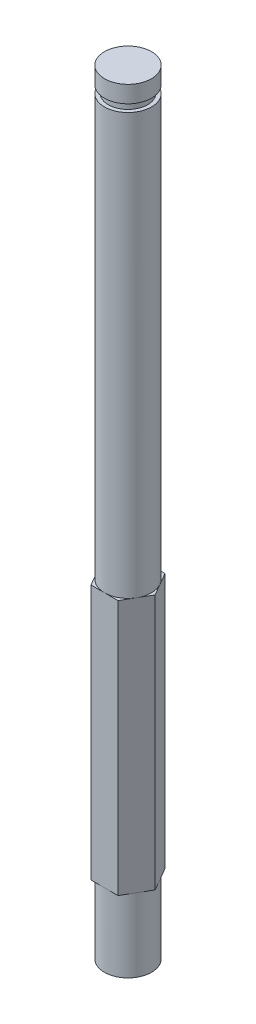
ISO-10303-21;
HEADER;
FILE_DESCRIPTION(('STEP AP214'),'2;1');
FILE_NAME('part.step','',(''),(''),'','','');
FILE_SCHEMA(('AUTOMOTIVE_DESIGN { 1 0 10303 214 1 1 1 1 }'));
ENDSEC;
DATA;
#1=APPLICATION_CONTEXT('core data for automotive mechanical design processes');
#2=APPLICATION_PROTOCOL_DEFINITION('international standard','automotive_design',2000,#1);
#3=PRODUCT_CONTEXT('',#1,'mechanical');
#4=PRODUCT('Part','Part','',(#3));
#5=PRODUCT_RELATED_PRODUCT_CATEGORY('part','',(#4));
#6=PRODUCT_DEFINITION_FORMATION('','',#4);
#7=PRODUCT_DEFINITION_CONTEXT('part definition',#1,'design');
#8=PRODUCT_DEFINITION('design','',#6,#7);
#9=PRODUCT_DEFINITION_SHAPE('','',#8);
#10=(LENGTH_UNIT() NAMED_UNIT(*) SI_UNIT(.MILLI.,.METRE.));
#11=(NAMED_UNIT(*) PLANE_ANGLE_UNIT() SI_UNIT($,.RADIAN.));
#12=(NAMED_UNIT(*) SI_UNIT($,.STERADIAN.) SOLID_ANGLE_UNIT());
#13=UNCERTAINTY_MEASURE_WITH_UNIT(LENGTH_MEASURE(1.E-05),#10,'distance_accuracy_value','');
#14=(GEOMETRIC_REPRESENTATION_CONTEXT(3) GLOBAL_UNCERTAINTY_ASSIGNED_CONTEXT((#13)) GLOBAL_UNIT_ASSIGNED_CONTEXT((#10,
#11,#12)) REPRESENTATION_CONTEXT('',''));
#15=CARTESIAN_POINT('',(0.,0.,0.));
#16=DIRECTION('',(0.,0.,1.));
#17=DIRECTION('',(1.,0.,0.));
#18=AXIS2_PLACEMENT_3D('',#15,#16,#17);
#19=CARTESIAN_POINT('',(0.,0.,0.));
#20=DIRECTION('',(0.,1.,0.));
#21=DIRECTION('',(0.,0.,1.));
#22=AXIS2_PLACEMENT_3D('',#19,#20,#21);
#23=PLANE('',#22);
#24=CARTESIAN_POINT('',(0.,0.,0.));
#25=DIRECTION('',(0.,-1.,0.));
#26=DIRECTION('',(0.,0.,-1.));
#27=AXIS2_PLACEMENT_3D('',#24,#25,#26);
#28=CIRCLE('',#27,3.175);
#29=CARTESIAN_POINT('',(0.,0.,-3.175));
#30=VERTEX_POINT('',#29);
#31=CARTESIAN_POINT('',(2.74963065701559,0.,-1.5875));
#32=VERTEX_POINT('',#31);
#33=EDGE_CURVE('E54',#30,#32,#28,.T.);
#34=ORIENTED_EDGE('',*,*,#33,.F.);
#35=DIRECTION('',(-1.,0.,0.));
#36=VECTOR('',#35,1.);
#37=CARTESIAN_POINT('',(1.83308710467706,0.,-3.175));
#38=LINE('',#37,#36);
#39=CARTESIAN_POINT('',(1.83308710467706,0.,-3.175));
#40=VERTEX_POINT('',#39);
#41=EDGE_CURVE('E138',#40,#30,#38,.T.);
#42=ORIENTED_EDGE('',*,*,#41,.F.);
#43=DIRECTION('',(-0.5,0.,-0.866025403784438));
#44=VECTOR('',#43,1.);
#45=CARTESIAN_POINT('',(3.66617420935412,0.,0.));
#46=LINE('',#45,#44);
#47=EDGE_CURVE('E155',#32,#40,#46,.T.);
#48=ORIENTED_EDGE('',*,*,#47,.F.);
#49=EDGE_LOOP('',(#34,#42,#48));
#50=FACE_BOUND('',#49,.T.);
#51=ADVANCED_FACE('F43',(#50),#23,.F.);
#52=CARTESIAN_POINT('',(2.74963065701559,0.,1.5875));
#53=VERTEX_POINT('',#52);
#54=EDGE_CURVE('E11',#32,#53,#28,.T.);
#55=ORIENTED_EDGE('',*,*,#54,.F.);
#56=CARTESIAN_POINT('',(3.66617420935412,0.,0.));
#57=VERTEX_POINT('',#56);
#58=EDGE_CURVE('E153',#57,#32,#46,.T.);
#59=ORIENTED_EDGE('',*,*,#58,.F.);
#60=DIRECTION('',(0.5,0.,-0.866025403784438));
#61=VECTOR('',#60,1.);
#62=CARTESIAN_POINT('',(1.83308710467706,0.,3.175));
#63=LINE('',#62,#61);
#64=EDGE_CURVE('E218',#53,#57,#63,.T.);
#65=ORIENTED_EDGE('',*,*,#64,.F.);
#66=EDGE_LOOP('',(#55,#59,#65));
#67=FACE_BOUND('',#66,.T.);
#68=ADVANCED_FACE('F269',(#67),#23,.F.);
#69=CARTESIAN_POINT('',(0.,0.,3.175));
#70=VERTEX_POINT('',#69);
#71=EDGE_CURVE('E52',#53,#70,#28,.T.);
#72=ORIENTED_EDGE('',*,*,#71,.F.);
#73=CARTESIAN_POINT('',(1.83308710467706,0.,3.175));
#74=VERTEX_POINT('',#73);
#75=EDGE_CURVE('E219',#74,#53,#63,.T.);
#76=ORIENTED_EDGE('',*,*,#75,.F.);
#77=DIRECTION('',(1.,0.,0.));
#78=VECTOR('',#77,1.);
#79=CARTESIAN_POINT('',(-1.83308710467706,0.,3.175));
#80=LINE('',#79,#78);
#81=EDGE_CURVE('E214',#70,#74,#80,.T.);
#82=ORIENTED_EDGE('',*,*,#81,.F.);
#83=EDGE_LOOP('',(#72,#76,#82));
#84=FACE_BOUND('',#83,.T.);
#85=ADVANCED_FACE('F264',(#84),#23,.F.);
#86=CARTESIAN_POINT('',(-2.74963065701559,0.,1.5875));
#87=VERTEX_POINT('',#86);
#88=EDGE_CURVE('E162',#70,#87,#28,.T.);
#89=ORIENTED_EDGE('',*,*,#88,.F.);
#90=CARTESIAN_POINT('',(-1.83308710467706,0.,3.175));
#91=VERTEX_POINT('',#90);
#92=EDGE_CURVE('E215',#91,#70,#80,.T.);
#93=ORIENTED_EDGE('',*,*,#92,.F.);
#94=DIRECTION('',(0.5,0.,0.866025403784438));
#95=VECTOR('',#94,1.);
#96=CARTESIAN_POINT('',(-3.66617420935413,0.,0.));
#97=LINE('',#96,#95);
#98=EDGE_CURVE('E210',#87,#91,#97,.T.);
#99=ORIENTED_EDGE('',*,*,#98,.F.);
#100=EDGE_LOOP('',(#89,#93,#99));
#101=FACE_BOUND('',#100,.T.);
#102=ADVANCED_FACE('F291',(#101),#23,.F.);
#103=CARTESIAN_POINT('',(-2.74963065701559,0.,-1.5875));
#104=VERTEX_POINT('',#103);
#105=EDGE_CURVE('E68',#87,#104,#28,.T.);
#106=ORIENTED_EDGE('',*,*,#105,.F.);
#107=CARTESIAN_POINT('',(-3.66617420935413,0.,0.));
#108=VERTEX_POINT('',#107);
#109=EDGE_CURVE('E211',#108,#87,#97,.T.);
#110=ORIENTED_EDGE('',*,*,#109,.F.);
#111=DIRECTION('',(-0.5,0.,0.866025403784438));
#112=VECTOR('',#111,1.);
#113=CARTESIAN_POINT('',(-1.83308710467706,0.,-3.175));
#114=LINE('',#113,#112);
#115=EDGE_CURVE('E148',#104,#108,#114,.T.);
#116=ORIENTED_EDGE('',*,*,#115,.F.);
#117=EDGE_LOOP('',(#106,#110,#116));
#118=FACE_BOUND('',#117,.T.);
#119=ADVANCED_FACE('F292',(#118),#23,.F.);
#120=CARTESIAN_POINT('',(0.,34.544,0.));
#121=DIRECTION('',(0.,1.,0.));
#122=DIRECTION('',(0.,0.,1.));
#123=AXIS2_PLACEMENT_3D('',#120,#121,#122);
#124=PLANE('',#123);
#125=CARTESIAN_POINT('',(0.,34.544,0.));
#126=DIRECTION('',(0.,1.,0.));
#127=DIRECTION('',(0.,0.,1.));
#128=AXIS2_PLACEMENT_3D('',#125,#126,#127);
#129=CIRCLE('',#128,3.175);
#130=CARTESIAN_POINT('',(0.,34.544,3.175));
#131=VERTEX_POINT('',#130);
#132=CARTESIAN_POINT('',(2.74963065701559,34.544,1.5875));
#133=VERTEX_POINT('',#132);
#134=EDGE_CURVE('E176',#131,#133,#129,.T.);
#135=ORIENTED_EDGE('',*,*,#134,.F.);
#136=DIRECTION('',(1.,0.,0.));
#137=VECTOR('',#136,1.);
#138=CARTESIAN_POINT('',(-1.83308710467706,34.544,3.175));
#139=LINE('',#138,#137);
#140=CARTESIAN_POINT('',(1.83308710467706,34.544,3.175));
#141=VERTEX_POINT('',#140);
#142=EDGE_CURVE('E200',#131,#141,#139,.T.);
#143=ORIENTED_EDGE('',*,*,#142,.T.);
#144=DIRECTION('',(0.5,0.,-0.866025403784438));
#145=VECTOR('',#144,1.);
#146=CARTESIAN_POINT('',(1.83308710467706,34.544,3.175));
#147=LINE('',#146,#145);
#148=EDGE_CURVE('E204',#141,#133,#147,.T.);
#149=ORIENTED_EDGE('',*,*,#148,.T.);
#150=EDGE_LOOP('',(#135,#143,#149));
#151=FACE_BOUND('',#150,.T.);
#152=ADVANCED_FACE('F255',(#151),#124,.T.);
#153=CARTESIAN_POINT('',(2.74963065701559,34.544,-1.5875));
#154=VERTEX_POINT('',#153);
#155=EDGE_CURVE('E164',#133,#154,#129,.T.);
#156=ORIENTED_EDGE('',*,*,#155,.F.);
#157=CARTESIAN_POINT('',(3.66617420935412,34.544,0.));
#158=VERTEX_POINT('',#157);
#159=EDGE_CURVE('E203',#133,#158,#147,.T.);
#160=ORIENTED_EDGE('',*,*,#159,.T.);
#161=DIRECTION('',(-0.5,0.,-0.866025403784438));
#162=VECTOR('',#161,1.);
#163=CARTESIAN_POINT('',(3.66617420935412,34.544,0.));
#164=LINE('',#163,#162);
#165=EDGE_CURVE('E184',#158,#154,#164,.T.);
#166=ORIENTED_EDGE('',*,*,#165,.T.);
#167=EDGE_LOOP('',(#156,#160,#166));
#168=FACE_BOUND('',#167,.T.);
#169=ADVANCED_FACE('F248',(#168),#124,.T.);
#170=CARTESIAN_POINT('',(0.,34.544,-3.175));
#171=VERTEX_POINT('',#170);
#172=EDGE_CURVE('E241',#154,#171,#129,.T.);
#173=ORIENTED_EDGE('',*,*,#172,.F.);
#174=CARTESIAN_POINT('',(1.83308710467706,34.544,-3.175));
#175=VERTEX_POINT('',#174);
#176=EDGE_CURVE('E188',#154,#175,#164,.T.);
#177=ORIENTED_EDGE('',*,*,#176,.T.);
#178=DIRECTION('',(-1.,0.,0.));
#179=VECTOR('',#178,1.);
#180=CARTESIAN_POINT('',(1.83308710467706,34.544,-3.175));
#181=LINE('',#180,#179);
#182=EDGE_CURVE('E189',#175,#171,#181,.T.);
#183=ORIENTED_EDGE('',*,*,#182,.T.);
#184=EDGE_LOOP('',(#173,#177,#183));
#185=FACE_BOUND('',#184,.T.);
#186=ADVANCED_FACE('F273',(#185),#124,.T.);
#187=CARTESIAN_POINT('',(-2.74963065701559,34.544,-1.5875));
#188=VERTEX_POINT('',#187);
#189=EDGE_CURVE('E239',#171,#188,#129,.T.);
#190=ORIENTED_EDGE('',*,*,#189,.F.);
#191=CARTESIAN_POINT('',(-1.83308710467706,34.544,-3.175));
#192=VERTEX_POINT('',#191);
#193=EDGE_CURVE('E187',#171,#192,#181,.T.);
#194=ORIENTED_EDGE('',*,*,#193,.T.);
#195=DIRECTION('',(-0.5,0.,0.866025403784438));
#196=VECTOR('',#195,1.);
#197=CARTESIAN_POINT('',(-1.83308710467706,34.544,-3.175));
#198=LINE('',#197,#196);
#199=EDGE_CURVE('E193',#192,#188,#198,.T.);
#200=ORIENTED_EDGE('',*,*,#199,.T.);
#201=EDGE_LOOP('',(#190,#194,#200));
#202=FACE_BOUND('',#201,.T.);
#203=ADVANCED_FACE('F276',(#202),#124,.T.);
#204=CARTESIAN_POINT('',(-2.74963065701559,34.544,1.5875));
#205=VERTEX_POINT('',#204);
#206=EDGE_CURVE('E236',#188,#205,#129,.T.);
#207=ORIENTED_EDGE('',*,*,#206,.F.);
#208=CARTESIAN_POINT('',(-3.66617420935413,34.544,0.));
#209=VERTEX_POINT('',#208);
#210=EDGE_CURVE('E192',#188,#209,#198,.T.);
#211=ORIENTED_EDGE('',*,*,#210,.T.);
#212=DIRECTION('',(0.5,0.,0.866025403784438));
#213=VECTOR('',#212,1.);
#214=CARTESIAN_POINT('',(-3.66617420935413,34.544,0.));
#215=LINE('',#214,#213);
#216=EDGE_CURVE('E197',#209,#205,#215,.T.);
#217=ORIENTED_EDGE('',*,*,#216,.T.);
#218=EDGE_LOOP('',(#207,#211,#217));
#219=FACE_BOUND('',#218,.T.);
#220=ADVANCED_FACE('F282',(#219),#124,.T.);
#221=CARTESIAN_POINT('',(3.66617420935412,34.544,0.));
#222=DIRECTION('',(-0.866025403784438,0.,0.5));
#223=DIRECTION('',(0.5,0.,0.866025403784439));
#224=AXIS2_PLACEMENT_3D('',#221,#222,#223);
#225=PLANE('',#224);
#226=ORIENTED_EDGE('',*,*,#58,.T.);
#227=ORIENTED_EDGE('',*,*,#47,.T.);
#228=DIRECTION('',(0.,-1.,0.));
#229=VECTOR('',#228,1.);
#230=CARTESIAN_POINT('',(1.83308710467706,34.544,-3.175));
#231=LINE('',#230,#229);
#232=EDGE_CURVE('E47',#175,#40,#231,.T.);
#233=ORIENTED_EDGE('',*,*,#232,.F.);
#234=ORIENTED_EDGE('',*,*,#176,.F.);
#235=ORIENTED_EDGE('',*,*,#165,.F.);
#236=DIRECTION('',(0.,-1.,0.));
#237=VECTOR('',#236,1.);
#238=CARTESIAN_POINT('',(3.66617420935412,34.544,0.));
#239=LINE('',#238,#237);
#240=EDGE_CURVE('E207',#158,#57,#239,.T.);
#241=ORIENTED_EDGE('',*,*,#240,.T.);
#242=EDGE_LOOP('',(#226,#227,#233,#234,#235,#241));
#243=FACE_BOUND('',#242,.T.);
#244=ADVANCED_FACE('F45',(#243),#225,.F.);
#245=CARTESIAN_POINT('',(1.83308710467706,34.544,-3.175));
#246=DIRECTION('',(0.,0.,1.));
#247=DIRECTION('',(1.,0.,0.));
#248=AXIS2_PLACEMENT_3D('',#245,#246,#247);
#249=PLANE('',#248);
#250=ORIENTED_EDGE('',*,*,#41,.T.);
#251=CARTESIAN_POINT('',(-1.83308710467706,0.,-3.175));
#252=VERTEX_POINT('',#251);
#253=EDGE_CURVE('E141',#30,#252,#38,.T.);
#254=ORIENTED_EDGE('',*,*,#253,.T.);
#255=DIRECTION('',(0.,-1.,0.));
#256=VECTOR('',#255,1.);
#257=CARTESIAN_POINT('',(-1.83308710467706,34.544,-3.175));
#258=LINE('',#257,#256);
#259=EDGE_CURVE('E232',#192,#252,#258,.T.);
#260=ORIENTED_EDGE('',*,*,#259,.F.);
#261=ORIENTED_EDGE('',*,*,#193,.F.);
#262=ORIENTED_EDGE('',*,*,#182,.F.);
#263=ORIENTED_EDGE('',*,*,#232,.T.);
#264=EDGE_LOOP('',(#250,#254,#260,#261,#262,#263));
#265=FACE_BOUND('',#264,.T.);
#266=ADVANCED_FACE('F139',(#265),#249,.F.);
#267=CARTESIAN_POINT('',(-1.83308710467706,34.544,-3.175));
#268=DIRECTION('',(0.866025403784438,0.,0.5));
#269=DIRECTION('',(0.5,0.,-0.866025403784439));
#270=AXIS2_PLACEMENT_3D('',#267,#268,#269);
#271=PLANE('',#270);
#272=EDGE_CURVE('E152',#252,#104,#114,.T.);
#273=ORIENTED_EDGE('',*,*,#272,.T.);
#274=ORIENTED_EDGE('',*,*,#115,.T.);
#275=DIRECTION('',(0.,-1.,0.));
#276=VECTOR('',#275,1.);
#277=CARTESIAN_POINT('',(-3.66617420935413,34.544,0.));
#278=LINE('',#277,#276);
#279=EDGE_CURVE('E230',#209,#108,#278,.T.);
#280=ORIENTED_EDGE('',*,*,#279,.F.);
#281=ORIENTED_EDGE('',*,*,#210,.F.);
#282=ORIENTED_EDGE('',*,*,#199,.F.);
#283=ORIENTED_EDGE('',*,*,#259,.T.);
#284=EDGE_LOOP('',(#273,#274,#280,#281,#282,#283));
#285=FACE_BOUND('',#284,.T.);
#286=ADVANCED_FACE('F278',(#285),#271,.F.);
#287=CARTESIAN_POINT('',(-3.66617420935413,34.544,0.));
#288=DIRECTION('',(0.866025403784438,0.,-0.5));
#289=DIRECTION('',(-0.5,0.,-0.866025403784439));
#290=AXIS2_PLACEMENT_3D('',#287,#288,#289);
#291=PLANE('',#290);
#292=ORIENTED_EDGE('',*,*,#109,.T.);
#293=ORIENTED_EDGE('',*,*,#98,.T.);
#294=DIRECTION('',(0.,-1.,0.));
#295=VECTOR('',#294,1.);
#296=CARTESIAN_POINT('',(-1.83308710467706,34.544,3.175));
#297=LINE('',#296,#295);
#298=CARTESIAN_POINT('',(-1.83308710467706,34.544,3.175));
#299=VERTEX_POINT('',#298);
#300=EDGE_CURVE('E227',#299,#91,#297,.T.);
#301=ORIENTED_EDGE('',*,*,#300,.F.);
#302=EDGE_CURVE('E196',#205,#299,#215,.T.);
#303=ORIENTED_EDGE('',*,*,#302,.F.);
#304=ORIENTED_EDGE('',*,*,#216,.F.);
#305=ORIENTED_EDGE('',*,*,#279,.T.);
#306=EDGE_LOOP('',(#292,#293,#301,#303,#304,#305));
#307=FACE_BOUND('',#306,.T.);
#308=ADVANCED_FACE('F285',(#307),#291,.F.);
#309=CARTESIAN_POINT('',(-1.83308710467706,34.544,3.175));
#310=DIRECTION('',(0.,0.,-1.));
#311=DIRECTION('',(-1.,0.,0.));
#312=AXIS2_PLACEMENT_3D('',#309,#310,#311);
#313=PLANE('',#312);
#314=ORIENTED_EDGE('',*,*,#92,.T.);
#315=ORIENTED_EDGE('',*,*,#81,.T.);
#316=DIRECTION('',(0.,-1.,0.));
#317=VECTOR('',#316,1.);
#318=CARTESIAN_POINT('',(1.83308710467706,34.544,3.175));
#319=LINE('',#318,#317);
#320=EDGE_CURVE('E224',#141,#74,#319,.T.);
#321=ORIENTED_EDGE('',*,*,#320,.F.);
#322=ORIENTED_EDGE('',*,*,#142,.F.);
#323=EDGE_CURVE('E201',#299,#131,#139,.T.);
#324=ORIENTED_EDGE('',*,*,#323,.F.);
#325=ORIENTED_EDGE('',*,*,#300,.T.);
#326=EDGE_LOOP('',(#314,#315,#321,#322,#324,#325));
#327=FACE_BOUND('',#326,.T.);
#328=ADVANCED_FACE('F260',(#327),#313,.F.);
#329=CARTESIAN_POINT('',(1.83308710467706,34.544,3.175));
#330=DIRECTION('',(-0.866025403784439,0.,-0.5));
#331=DIRECTION('',(-0.5,0.,0.866025403784439));
#332=AXIS2_PLACEMENT_3D('',#329,#330,#331);
#333=PLANE('',#332);
#334=ORIENTED_EDGE('',*,*,#75,.T.);
#335=ORIENTED_EDGE('',*,*,#64,.T.);
#336=ORIENTED_EDGE('',*,*,#240,.F.);
#337=ORIENTED_EDGE('',*,*,#159,.F.);
#338=ORIENTED_EDGE('',*,*,#148,.F.);
#339=ORIENTED_EDGE('',*,*,#320,.T.);
#340=EDGE_LOOP('',(#334,#335,#336,#337,#338,#339));
#341=FACE_BOUND('',#340,.T.);
#342=ADVANCED_FACE('F253',(#341),#333,.F.);
#343=EDGE_CURVE('E183',#205,#131,#129,.T.);
#344=ORIENTED_EDGE('',*,*,#343,.F.);
#345=ORIENTED_EDGE('',*,*,#302,.T.);
#346=ORIENTED_EDGE('',*,*,#323,.T.);
#347=EDGE_LOOP('',(#344,#345,#346));
#348=FACE_BOUND('',#347,.T.);
#349=ADVANCED_FACE('F288',(#348),#124,.T.);
#350=EDGE_CURVE('E61',#104,#30,#28,.T.);
#351=ORIENTED_EDGE('',*,*,#350,.F.);
#352=ORIENTED_EDGE('',*,*,#272,.F.);
#353=ORIENTED_EDGE('',*,*,#253,.F.);
#354=EDGE_LOOP('',(#351,#352,#353));
#355=FACE_BOUND('',#354,.T.);
#356=ADVANCED_FACE('F150',(#355),#23,.F.);
#357=CARTESIAN_POINT('',(0.,91.44,0.));
#358=DIRECTION('',(0.,-1.,0.));
#359=DIRECTION('',(0.,0.,-1.));
#360=AXIS2_PLACEMENT_3D('',#357,#358,#359);
#361=CYLINDRICAL_SURFACE('',#360,3.175);
#362=CARTESIAN_POINT('',(0.,91.44,0.));
#363=DIRECTION('',(0.,1.,0.));
#364=DIRECTION('',(0.,0.,1.));
#365=AXIS2_PLACEMENT_3D('',#362,#363,#364);
#366=CIRCLE('',#365,3.175);
#367=CARTESIAN_POINT('',(0.,91.44,3.175));
#368=VERTEX_POINT('',#367);
#369=EDGE_CURVE('E178',#368,#368,#366,.T.);
#370=ORIENTED_EDGE('',*,*,#369,.F.);
#371=EDGE_LOOP('',(#370));
#372=FACE_BOUND('',#371,.T.);
#373=ORIENTED_EDGE('',*,*,#134,.T.);
#374=ORIENTED_EDGE('',*,*,#155,.T.);
#375=ORIENTED_EDGE('',*,*,#172,.T.);
#376=ORIENTED_EDGE('',*,*,#189,.T.);
#377=ORIENTED_EDGE('',*,*,#206,.T.);
#378=ORIENTED_EDGE('',*,*,#343,.T.);
#379=EDGE_LOOP('',(#373,#374,#375,#376,#377,#378));
#380=FACE_BOUND('',#379,.T.);
#381=ADVANCED_FACE('F244',(#372,#380),#361,.T.);
#382=CARTESIAN_POINT('',(0.,91.44,0.));
#383=DIRECTION('',(0.,1.,0.));
#384=DIRECTION('',(0.,0.,1.));
#385=AXIS2_PLACEMENT_3D('',#382,#383,#384);
#386=PLANE('',#385);
#387=CARTESIAN_POINT('',(0.,91.44,0.));
#388=DIRECTION('',(0.,1.,0.));
#389=DIRECTION('',(0.,0.,1.));
#390=AXIS2_PLACEMENT_3D('',#387,#388,#389);
#391=CIRCLE('',#390,2.667);
#392=CARTESIAN_POINT('',(0.,91.44,2.667));
#393=VERTEX_POINT('',#392);
#394=EDGE_CURVE('E161',#393,#393,#391,.T.);
#395=ORIENTED_EDGE('',*,*,#394,.F.);
#396=EDGE_LOOP('',(#395));
#397=FACE_BOUND('',#396,.T.);
#398=ORIENTED_EDGE('',*,*,#369,.T.);
#399=EDGE_LOOP('',(#398));
#400=FACE_BOUND('',#399,.T.);
#401=ADVANCED_FACE('F370',(#397,#400),#386,.T.);
#402=CARTESIAN_POINT('',(0.,92.456,0.));
#403=DIRECTION('',(0.,-1.,0.));
#404=DIRECTION('',(0.,0.,-1.));
#405=AXIS2_PLACEMENT_3D('',#402,#403,#404);
#406=CYLINDRICAL_SURFACE('',#405,2.667);
#407=CARTESIAN_POINT('',(0.,92.456,0.));
#408=DIRECTION('',(0.,1.,0.));
#409=DIRECTION('',(0.,0.,1.));
#410=AXIS2_PLACEMENT_3D('',#407,#408,#409);
#411=CIRCLE('',#410,2.667);
#412=CARTESIAN_POINT('',(0.,92.456,2.667));
#413=VERTEX_POINT('',#412);
#414=EDGE_CURVE('E171',#413,#413,#411,.T.);
#415=ORIENTED_EDGE('',*,*,#414,.F.);
#416=EDGE_LOOP('',(#415));
#417=FACE_BOUND('',#416,.T.);
#418=ORIENTED_EDGE('',*,*,#394,.T.);
#419=EDGE_LOOP('',(#418));
#420=FACE_BOUND('',#419,.T.);
#421=ADVANCED_FACE('F366',(#417,#420),#406,.T.);
#422=CARTESIAN_POINT('',(0.,94.742,0.));
#423=DIRECTION('',(0.,-1.,0.));
#424=DIRECTION('',(0.,0.,-1.));
#425=AXIS2_PLACEMENT_3D('',#422,#423,#424);
#426=CYLINDRICAL_SURFACE('',#425,3.175);
#427=CARTESIAN_POINT('',(0.,94.742,0.));
#428=DIRECTION('',(0.,1.,0.));
#429=DIRECTION('',(0.,0.,1.));
#430=AXIS2_PLACEMENT_3D('',#427,#428,#429);
#431=CIRCLE('',#430,3.175);
#432=CARTESIAN_POINT('',(0.,94.742,3.175));
#433=VERTEX_POINT('',#432);
#434=EDGE_CURVE('E168',#433,#433,#431,.T.);
#435=ORIENTED_EDGE('',*,*,#434,.F.);
#436=EDGE_LOOP('',(#435));
#437=FACE_BOUND('',#436,.T.);
#438=CARTESIAN_POINT('',(0.,92.456,0.));
#439=DIRECTION('',(0.,1.,0.));
#440=DIRECTION('',(0.,0.,1.));
#441=AXIS2_PLACEMENT_3D('',#438,#439,#440);
#442=CIRCLE('',#441,3.175);
#443=CARTESIAN_POINT('',(0.,92.456,3.175));
#444=VERTEX_POINT('',#443);
#445=EDGE_CURVE('E172',#444,#444,#442,.T.);
#446=ORIENTED_EDGE('',*,*,#445,.T.);
#447=EDGE_LOOP('',(#446));
#448=FACE_BOUND('',#447,.T.);
#449=ADVANCED_FACE('F360',(#437,#448),#426,.T.);
#450=CARTESIAN_POINT('',(0.,94.742,0.));
#451=DIRECTION('',(0.,1.,0.));
#452=DIRECTION('',(0.,0.,1.));
#453=AXIS2_PLACEMENT_3D('',#450,#451,#452);
#454=PLANE('',#453);
#455=ORIENTED_EDGE('',*,*,#434,.T.);
#456=EDGE_LOOP('',(#455));
#457=FACE_BOUND('',#456,.T.);
#458=ADVANCED_FACE('F357',(#457),#454,.T.);
#459=CARTESIAN_POINT('',(0.,92.456,0.));
#460=DIRECTION('',(0.,1.,0.));
#461=DIRECTION('',(0.,0.,1.));
#462=AXIS2_PLACEMENT_3D('',#459,#460,#461);
#463=PLANE('',#462);
#464=ORIENTED_EDGE('',*,*,#414,.T.);
#465=EDGE_LOOP('',(#464));
#466=FACE_BOUND('',#465,.T.);
#467=ORIENTED_EDGE('',*,*,#445,.F.);
#468=EDGE_LOOP('',(#467));
#469=FACE_BOUND('',#468,.T.);
#470=ADVANCED_FACE('F342',(#466,#469),#463,.F.);
#471=CARTESIAN_POINT('',(0.,-9.906,0.));
#472=DIRECTION('',(0.,1.,0.));
#473=DIRECTION('',(0.,0.,1.));
#474=AXIS2_PLACEMENT_3D('',#471,#472,#473);
#475=CYLINDRICAL_SURFACE('',#474,3.175);
#476=CARTESIAN_POINT('',(0.,-9.906,0.));
#477=DIRECTION('',(0.,-1.,0.));
#478=DIRECTION('',(0.,0.,-1.));
#479=AXIS2_PLACEMENT_3D('',#476,#477,#478);
#480=CIRCLE('',#479,3.175);
#481=CARTESIAN_POINT('',(0.,-9.906,-3.175));
#482=VERTEX_POINT('',#481);
#483=EDGE_CURVE('E158',#482,#482,#480,.T.);
#484=ORIENTED_EDGE('',*,*,#483,.F.);
#485=EDGE_LOOP('',(#484));
#486=FACE_BOUND('',#485,.T.);
#487=ORIENTED_EDGE('',*,*,#33,.T.);
#488=ORIENTED_EDGE('',*,*,#54,.T.);
#489=ORIENTED_EDGE('',*,*,#71,.T.);
#490=ORIENTED_EDGE('',*,*,#88,.T.);
#491=ORIENTED_EDGE('',*,*,#105,.T.);
#492=ORIENTED_EDGE('',*,*,#350,.T.);
#493=EDGE_LOOP('',(#487,#488,#489,#490,#491,#492));
#494=FACE_BOUND('',#493,.T.);
#495=ADVANCED_FACE('F159',(#486,#494),#475,.T.);
#496=CARTESIAN_POINT('',(0.,-9.906,0.));
#497=DIRECTION('',(0.,-1.,0.));
#498=DIRECTION('',(0.,0.,-1.));
#499=AXIS2_PLACEMENT_3D('',#496,#497,#498);
#500=PLANE('',#499);
#501=ORIENTED_EDGE('',*,*,#483,.T.);
#502=EDGE_LOOP('',(#501));
#503=FACE_BOUND('',#502,.T.);
#504=ADVANCED_FACE('F341',(#503),#500,.T.);
#505=CLOSED_SHELL('',(#51,#68,#85,#102,#119,#152,#169,#186,#203,#220,#244,#266,#286,#308,#328,
#342,#349,#356,#381,#401,#421,#449,#458,#470,#495,#504));
#506=MANIFOLD_SOLID_BREP('B2',#505);
#507=ADVANCED_BREP_SHAPE_REPRESENTATION('',(#18,#506),#14);
#508=SHAPE_DEFINITION_REPRESENTATION(#9,#507);
ENDSEC;
END-ISO-10303-21;
